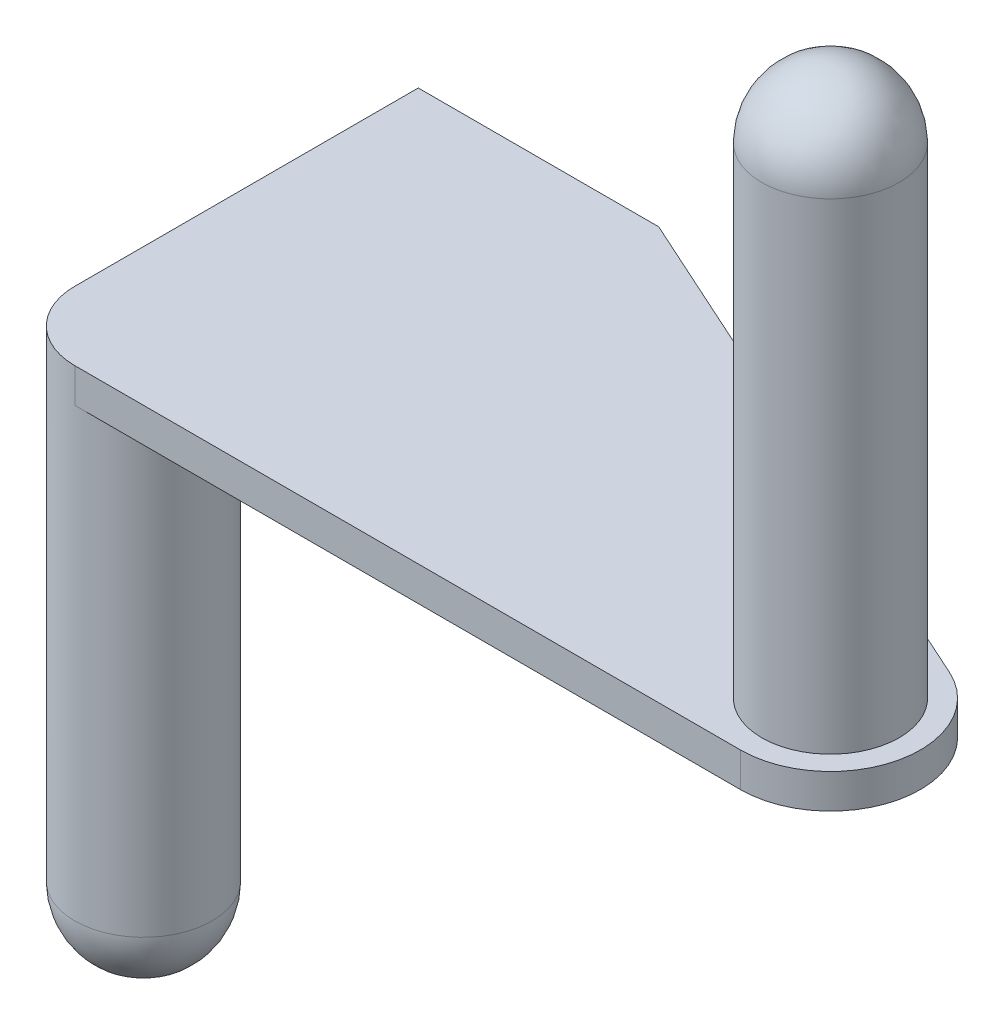
ISO-10303-21;
HEADER;
FILE_DESCRIPTION(('STEP AP214'),'2;1');
FILE_NAME('part.step','',(''),(''),'','','');
FILE_SCHEMA(('AUTOMOTIVE_DESIGN { 1 0 10303 214 1 1 1 1 }'));
ENDSEC;
DATA;
#1=APPLICATION_CONTEXT('core data for automotive mechanical design processes');
#2=APPLICATION_PROTOCOL_DEFINITION('international standard','automotive_design',2000,#1);
#3=PRODUCT_CONTEXT('',#1,'mechanical');
#4=PRODUCT('Part','Part','',(#3));
#5=PRODUCT_RELATED_PRODUCT_CATEGORY('part','',(#4));
#6=PRODUCT_DEFINITION_FORMATION('','',#4);
#7=PRODUCT_DEFINITION_CONTEXT('part definition',#1,'design');
#8=PRODUCT_DEFINITION('design','',#6,#7);
#9=PRODUCT_DEFINITION_SHAPE('','',#8);
#10=(LENGTH_UNIT() NAMED_UNIT(*) SI_UNIT(.MILLI.,.METRE.));
#11=(NAMED_UNIT(*) PLANE_ANGLE_UNIT() SI_UNIT($,.RADIAN.));
#12=(NAMED_UNIT(*) SI_UNIT($,.STERADIAN.) SOLID_ANGLE_UNIT());
#13=UNCERTAINTY_MEASURE_WITH_UNIT(LENGTH_MEASURE(1.E-05),#10,'distance_accuracy_value','');
#14=(GEOMETRIC_REPRESENTATION_CONTEXT(3) GLOBAL_UNCERTAINTY_ASSIGNED_CONTEXT((#13)) GLOBAL_UNIT_ASSIGNED_CONTEXT((#10,
#11,#12)) REPRESENTATION_CONTEXT('',''));
#15=CARTESIAN_POINT('',(0.,0.,0.));
#16=DIRECTION('',(0.,0.,1.));
#17=DIRECTION('',(1.,0.,0.));
#18=AXIS2_PLACEMENT_3D('',#15,#16,#17);
#19=CARTESIAN_POINT('',(-38.3909419454001,-16.,0.));
#20=DIRECTION('',(0.,1.,0.));
#21=DIRECTION('',(0.,0.,1.));
#22=AXIS2_PLACEMENT_3D('',#19,#20,#21);
#23=CYLINDRICAL_SURFACE('',#22,2.);
#24=CARTESIAN_POINT('',(-38.3909419454001,-1.,0.));
#25=DIRECTION('',(0.,-1.,0.));
#26=DIRECTION('',(0.,0.,-1.));
#27=AXIS2_PLACEMENT_3D('',#24,#25,#26);
#28=CIRCLE('',#27,2.);
#29=CARTESIAN_POINT('',(-38.3909419454001,-1.,2.));
#30=VERTEX_POINT('',#29);
#31=CARTESIAN_POINT('',(-40.3909419454001,-1.,0.));
#32=VERTEX_POINT('',#31);
#33=EDGE_CURVE('E179',#30,#32,#28,.F.);
#34=ORIENTED_EDGE('',*,*,#33,.F.);
#35=DIRECTION('',(0.,1.,0.));
#36=VECTOR('',#35,1.);
#37=CARTESIAN_POINT('',(-38.3909419454001,-1.,2.));
#38=LINE('',#37,#36);
#39=CARTESIAN_POINT('',(-38.3909419454001,0.,2.));
#40=VERTEX_POINT('',#39);
#41=EDGE_CURVE('E163',#30,#40,#38,.T.);
#42=ORIENTED_EDGE('',*,*,#41,.T.);
#43=CARTESIAN_POINT('',(-38.3909419454001,0.,0.));
#44=DIRECTION('',(0.,1.,0.));
#45=DIRECTION('',(0.,0.,1.));
#46=AXIS2_PLACEMENT_3D('',#43,#44,#45);
#47=CIRCLE('',#46,2.);
#48=CARTESIAN_POINT('',(-40.3909419454001,0.,0.));
#49=VERTEX_POINT('',#48);
#50=EDGE_CURVE('E196',#49,#40,#47,.T.);
#51=ORIENTED_EDGE('',*,*,#50,.F.);
#52=DIRECTION('',(0.,1.,0.));
#53=VECTOR('',#52,1.);
#54=CARTESIAN_POINT('',(-40.3909419454001,-1.,0.));
#55=LINE('',#54,#53);
#56=EDGE_CURVE('E189',#32,#49,#55,.T.);
#57=ORIENTED_EDGE('',*,*,#56,.F.);
#58=EDGE_LOOP('',(#34,#42,#51,#57));
#59=FACE_BOUND('',#58,.T.);
#60=CARTESIAN_POINT('',(-38.3909419454001,-14.,0.));
#61=DIRECTION('',(0.,1.,0.));
#62=DIRECTION('',(0.,0.,1.));
#63=AXIS2_PLACEMENT_3D('',#60,#61,#62);
#64=CIRCLE('',#63,2.);
#65=CARTESIAN_POINT('',(-38.3909419454001,-14.,2.));
#66=VERTEX_POINT('',#65);
#67=EDGE_CURVE('E191',#66,#66,#64,.T.);
#68=ORIENTED_EDGE('',*,*,#67,.T.);
#69=EDGE_LOOP('',(#68));
#70=FACE_BOUND('',#69,.T.);
#71=ADVANCED_FACE('F89',(#59,#70),#23,.T.);
#72=CARTESIAN_POINT('',(-38.3909419454001,0.,0.));
#73=DIRECTION('',(0.,1.,0.));
#74=DIRECTION('',(0.,0.,1.));
#75=AXIS2_PLACEMENT_3D('',#72,#73,#74);
#76=PLANE('',#75);
#77=CARTESIAN_POINT('',(-19.0077705365883,0.,-0.616828591188226));
#78=DIRECTION('',(0.,1.,0.));
#79=DIRECTION('',(0.,0.,1.));
#80=AXIS2_PLACEMENT_3D('',#77,#78,#79);
#81=CIRCLE('',#80,2.);
#82=CARTESIAN_POINT('',(-19.0077705365883,0.,1.38317140881178));
#83=VERTEX_POINT('',#82);
#84=EDGE_CURVE('E238',#83,#83,#81,.T.);
#85=ORIENTED_EDGE('',*,*,#84,.F.);
#86=EDGE_LOOP('',(#85));
#87=FACE_BOUND('',#86,.T.);
#88=ORIENTED_EDGE('',*,*,#50,.T.);
#89=DIRECTION('',(1.,0.,0.));
#90=VECTOR('',#89,1.);
#91=CARTESIAN_POINT('',(-19.0077705365883,0.,2.));
#92=LINE('',#91,#90);
#93=CARTESIAN_POINT('',(-19.0077705365883,0.,2.));
#94=VERTEX_POINT('',#93);
#95=EDGE_CURVE('E168',#40,#94,#92,.T.);
#96=ORIENTED_EDGE('',*,*,#95,.T.);
#97=CARTESIAN_POINT('',(-19.0077705365883,0.,-0.616828591188226));
#98=DIRECTION('',(0.,1.,0.));
#99=DIRECTION('',(0.,0.,-1.));
#100=AXIS2_PLACEMENT_3D('',#97,#98,#99);
#101=CIRCLE('',#100,2.61682859118822);
#102=CARTESIAN_POINT('',(-17.9286399146686,0.,-3.00078936613718));
#103=VERTEX_POINT('',#102);
#104=EDGE_CURVE('E251',#94,#103,#101,.T.);
#105=ORIENTED_EDGE('',*,*,#104,.T.);
#106=DIRECTION('',(-0.91101143688837,0.,-0.412381088143707));
#107=VECTOR('',#106,1.);
#108=CARTESIAN_POINT('',(-33.3909419454001,0.,-10.));
#109=LINE('',#108,#107);
#110=CARTESIAN_POINT('',(-33.3909419454001,0.,-10.));
#111=VERTEX_POINT('',#110);
#112=EDGE_CURVE('E254',#103,#111,#109,.T.);
#113=ORIENTED_EDGE('',*,*,#112,.T.);
#114=DIRECTION('',(-1.,0.,0.));
#115=VECTOR('',#114,1.);
#116=CARTESIAN_POINT('',(-40.3909419454001,0.,-10.));
#117=LINE('',#116,#115);
#118=CARTESIAN_POINT('',(-40.3909419454001,0.,-10.));
#119=VERTEX_POINT('',#118);
#120=EDGE_CURVE('E257',#111,#119,#117,.T.);
#121=ORIENTED_EDGE('',*,*,#120,.T.);
#122=DIRECTION('',(0.,0.,1.));
#123=VECTOR('',#122,1.);
#124=CARTESIAN_POINT('',(-40.3909419454001,0.,0.));
#125=LINE('',#124,#123);
#126=EDGE_CURVE('E184',#119,#49,#125,.T.);
#127=ORIENTED_EDGE('',*,*,#126,.T.);
#128=EDGE_LOOP('',(#88,#96,#105,#113,#121,#127));
#129=FACE_BOUND('',#128,.T.);
#130=ADVANCED_FACE('F269',(#87,#129),#76,.T.);
#131=CARTESIAN_POINT('',(-38.3909419454001,-14.,0.));
#132=DIRECTION('',(0.,1.,0.));
#133=DIRECTION('',(0.,0.,1.));
#134=AXIS2_PLACEMENT_3D('',#131,#132,#133);
#135=SPHERICAL_SURFACE('',#134,2.);
#136=ORIENTED_EDGE('',*,*,#67,.F.);
#137=EDGE_LOOP('',(#136));
#138=FACE_BOUND('',#137,.T.);
#139=ADVANCED_FACE('F294',(#138),#135,.T.);
#140=CARTESIAN_POINT('',(-40.3909419454001,-1.,0.));
#141=DIRECTION('',(-1.,0.,0.));
#142=DIRECTION('',(0.,0.,1.));
#143=AXIS2_PLACEMENT_3D('',#140,#141,#142);
#144=PLANE('',#143);
#145=ORIENTED_EDGE('',*,*,#126,.F.);
#146=DIRECTION('',(0.,1.,0.));
#147=VECTOR('',#146,1.);
#148=CARTESIAN_POINT('',(-40.3909419454001,-1.,-10.));
#149=LINE('',#148,#147);
#150=CARTESIAN_POINT('',(-40.3909419454001,-1.,-10.));
#151=VERTEX_POINT('',#150);
#152=EDGE_CURVE('E262',#151,#119,#149,.T.);
#153=ORIENTED_EDGE('',*,*,#152,.F.);
#154=DIRECTION('',(0.,0.,1.));
#155=VECTOR('',#154,1.);
#156=CARTESIAN_POINT('',(-40.3909419454001,-1.,0.));
#157=LINE('',#156,#155);
#158=EDGE_CURVE('E174',#151,#32,#157,.T.);
#159=ORIENTED_EDGE('',*,*,#158,.T.);
#160=ORIENTED_EDGE('',*,*,#56,.T.);
#161=EDGE_LOOP('',(#145,#153,#159,#160));
#162=FACE_BOUND('',#161,.T.);
#163=ADVANCED_FACE('F273',(#162),#144,.T.);
#164=CARTESIAN_POINT('',(-40.3909419454001,-1.,-10.));
#165=DIRECTION('',(0.,0.,-1.));
#166=DIRECTION('',(-1.,0.,0.));
#167=AXIS2_PLACEMENT_3D('',#164,#165,#166);
#168=PLANE('',#167);
#169=CARTESIAN_POINT('',(-36.8909419454001,-4.14203978385195,-10.));
#170=DIRECTION('',(0.,0.,-1.));
#171=DIRECTION('',(-1.,0.,0.));
#172=AXIS2_PLACEMENT_3D('',#169,#170,#171);
#173=CIRCLE('',#172,2.);
#174=CARTESIAN_POINT('',(-38.8909419454001,-4.14203978385195,-10.));
#175=VERTEX_POINT('',#174);
#176=EDGE_CURVE('E244',#175,#175,#173,.T.);
#177=ORIENTED_EDGE('',*,*,#176,.F.);
#178=EDGE_LOOP('',(#177));
#179=FACE_BOUND('',#178,.T.);
#180=DIRECTION('',(-1.,0.,0.));
#181=VECTOR('',#180,1.);
#182=CARTESIAN_POINT('',(-40.3909419454001,-1.,-10.));
#183=LINE('',#182,#181);
#184=CARTESIAN_POINT('',(-33.3909419454001,-1.,-10.));
#185=VERTEX_POINT('',#184);
#186=CARTESIAN_POINT('',(-34.6471946534279,-1.,-10.));
#187=VERTEX_POINT('',#186);
#188=EDGE_CURVE('E228',#185,#187,#183,.T.);
#189=ORIENTED_EDGE('',*,*,#188,.T.);
#190=CARTESIAN_POINT('',(-34.6471946534279,-1.2,-10.));
#191=DIRECTION('',(0.,0.,-1.));
#192=DIRECTION('',(-1.,0.,0.));
#193=AXIS2_PLACEMENT_3D('',#190,#191,#192);
#194=CIRCLE('',#193,0.2);
#195=CARTESIAN_POINT('',(-34.7684782908318,-1.35902917750551,-10.));
#196=VERTEX_POINT('',#195);
#197=EDGE_CURVE('E213',#187,#196,#194,.F.);
#198=ORIENTED_EDGE('',*,*,#197,.T.);
#199=CARTESIAN_POINT('',(-36.8909419454001,-4.14203978385195,-10.));
#200=DIRECTION('',(0.,0.,-1.));
#201=DIRECTION('',(-1.,0.,0.));
#202=AXIS2_PLACEMENT_3D('',#199,#200,#201);
#203=CIRCLE('',#202,3.5);
#204=CARTESIAN_POINT('',(-39.0134055999684,-1.35902917750551,-10.));
#205=VERTEX_POINT('',#204);
#206=EDGE_CURVE('E223',#196,#205,#203,.T.);
#207=ORIENTED_EDGE('',*,*,#206,.T.);
#208=CARTESIAN_POINT('',(-39.1346892373723,-1.2,-10.));
#209=DIRECTION('',(0.,0.,-1.));
#210=DIRECTION('',(-1.,0.,0.));
#211=AXIS2_PLACEMENT_3D('',#208,#209,#210);
#212=CIRCLE('',#211,0.2);
#213=CARTESIAN_POINT('',(-39.1346892373723,-1.,-10.));
#214=VERTEX_POINT('',#213);
#215=EDGE_CURVE('E98',#205,#214,#212,.F.);
#216=ORIENTED_EDGE('',*,*,#215,.T.);
#217=EDGE_CURVE('E220',#214,#151,#183,.T.);
#218=ORIENTED_EDGE('',*,*,#217,.T.);
#219=ORIENTED_EDGE('',*,*,#152,.T.);
#220=ORIENTED_EDGE('',*,*,#120,.F.);
#221=DIRECTION('',(0.,1.,0.));
#222=VECTOR('',#221,1.);
#223=CARTESIAN_POINT('',(-33.3909419454001,-1.,-10.));
#224=LINE('',#223,#222);
#225=EDGE_CURVE('E264',#185,#111,#224,.T.);
#226=ORIENTED_EDGE('',*,*,#225,.F.);
#227=EDGE_LOOP('',(#189,#198,#207,#216,#218,#219,#220,#226));
#228=FACE_BOUND('',#227,.T.);
#229=ADVANCED_FACE('F219',(#179,#228),#168,.T.);
#230=CARTESIAN_POINT('',(-33.3909419454001,-1.,-10.));
#231=DIRECTION('',(0.412381088143707,0.,-0.91101143688837));
#232=DIRECTION('',(-0.91101143688837,0.,-0.412381088143707));
#233=AXIS2_PLACEMENT_3D('',#230,#231,#232);
#234=PLANE('',#233);
#235=ORIENTED_EDGE('',*,*,#112,.F.);
#236=DIRECTION('',(0.,1.,0.));
#237=VECTOR('',#236,1.);
#238=CARTESIAN_POINT('',(-17.9286399146686,-1.,-3.00078936613718));
#239=LINE('',#238,#237);
#240=CARTESIAN_POINT('',(-17.9286399146686,-1.,-3.00078936613718));
#241=VERTEX_POINT('',#240);
#242=EDGE_CURVE('E266',#241,#103,#239,.T.);
#243=ORIENTED_EDGE('',*,*,#242,.F.);
#244=DIRECTION('',(-0.91101143688837,0.,-0.412381088143707));
#245=VECTOR('',#244,1.);
#246=CARTESIAN_POINT('',(-33.3909419454001,-1.,-10.));
#247=LINE('',#246,#245);
#248=EDGE_CURVE('E229',#241,#185,#247,.T.);
#249=ORIENTED_EDGE('',*,*,#248,.T.);
#250=ORIENTED_EDGE('',*,*,#225,.T.);
#251=EDGE_LOOP('',(#235,#243,#249,#250));
#252=FACE_BOUND('',#251,.T.);
#253=ADVANCED_FACE('F278',(#252),#234,.T.);
#254=CARTESIAN_POINT('',(-19.0077705365883,-1.,-0.616828591188226));
#255=DIRECTION('',(0.,1.,0.));
#256=DIRECTION('',(0.,0.,1.));
#257=AXIS2_PLACEMENT_3D('',#254,#255,#256);
#258=CYLINDRICAL_SURFACE('',#257,2.61682859118822);
#259=ORIENTED_EDGE('',*,*,#104,.F.);
#260=DIRECTION('',(0.,1.,0.));
#261=VECTOR('',#260,1.);
#262=CARTESIAN_POINT('',(-19.0077705365883,-1.,2.));
#263=LINE('',#262,#261);
#264=CARTESIAN_POINT('',(-19.0077705365883,-1.,2.));
#265=VERTEX_POINT('',#264);
#266=EDGE_CURVE('E173',#265,#94,#263,.T.);
#267=ORIENTED_EDGE('',*,*,#266,.F.);
#268=CARTESIAN_POINT('',(-19.0077705365883,-1.,-0.616828591188226));
#269=DIRECTION('',(0.,1.,0.));
#270=DIRECTION('',(0.,0.,-1.));
#271=AXIS2_PLACEMENT_3D('',#268,#269,#270);
#272=CIRCLE('',#271,2.61682859118822);
#273=EDGE_CURVE('E183',#265,#241,#272,.T.);
#274=ORIENTED_EDGE('',*,*,#273,.T.);
#275=ORIENTED_EDGE('',*,*,#242,.T.);
#276=EDGE_LOOP('',(#259,#267,#274,#275));
#277=FACE_BOUND('',#276,.T.);
#278=ADVANCED_FACE('F280',(#277),#258,.T.);
#279=CARTESIAN_POINT('',(-19.0077705365883,-1.,2.));
#280=DIRECTION('',(0.,0.,1.));
#281=DIRECTION('',(1.,0.,0.));
#282=AXIS2_PLACEMENT_3D('',#279,#280,#281);
#283=PLANE('',#282);
#284=ORIENTED_EDGE('',*,*,#95,.F.);
#285=ORIENTED_EDGE('',*,*,#41,.F.);
#286=DIRECTION('',(1.,0.,0.));
#287=VECTOR('',#286,1.);
#288=CARTESIAN_POINT('',(-19.0077705365883,-1.,2.));
#289=LINE('',#288,#287);
#290=EDGE_CURVE('E166',#30,#265,#289,.T.);
#291=ORIENTED_EDGE('',*,*,#290,.T.);
#292=ORIENTED_EDGE('',*,*,#266,.T.);
#293=EDGE_LOOP('',(#284,#285,#291,#292));
#294=FACE_BOUND('',#293,.T.);
#295=ADVANCED_FACE('F165',(#294),#283,.T.);
#296=CARTESIAN_POINT('',(-38.3909419454001,-1.,0.));
#297=DIRECTION('',(0.,-1.,0.));
#298=DIRECTION('',(0.,0.,-1.));
#299=AXIS2_PLACEMENT_3D('',#296,#297,#298);
#300=PLANE('',#299);
#301=DIRECTION('',(1.,0.,0.));
#302=VECTOR('',#301,1.);
#303=CARTESIAN_POINT('',(-38.3909419454001,-1.,-7.));
#304=LINE('',#303,#302);
#305=CARTESIAN_POINT('',(-39.1346892373723,-1.,-7.));
#306=VERTEX_POINT('',#305);
#307=CARTESIAN_POINT('',(-34.6471946534279,-1.,-7.));
#308=VERTEX_POINT('',#307);
#309=EDGE_CURVE('E105',#306,#308,#304,.T.);
#310=ORIENTED_EDGE('',*,*,#309,.T.);
#311=DIRECTION('',(0.,0.,1.));
#312=VECTOR('',#311,1.);
#313=CARTESIAN_POINT('',(-34.6471946534279,-1.,-10.));
#314=LINE('',#313,#312);
#315=EDGE_CURVE('E209',#308,#187,#314,.F.);
#316=ORIENTED_EDGE('',*,*,#315,.T.);
#317=ORIENTED_EDGE('',*,*,#188,.F.);
#318=ORIENTED_EDGE('',*,*,#248,.F.);
#319=ORIENTED_EDGE('',*,*,#273,.F.);
#320=ORIENTED_EDGE('',*,*,#290,.F.);
#321=ORIENTED_EDGE('',*,*,#33,.T.);
#322=ORIENTED_EDGE('',*,*,#158,.F.);
#323=ORIENTED_EDGE('',*,*,#217,.F.);
#324=DIRECTION('',(0.,0.,1.));
#325=VECTOR('',#324,1.);
#326=CARTESIAN_POINT('',(-39.1346892373723,-1.,-7.));
#327=LINE('',#326,#325);
#328=EDGE_CURVE('E207',#214,#306,#327,.T.);
#329=ORIENTED_EDGE('',*,*,#328,.T.);
#330=EDGE_LOOP('',(#310,#316,#317,#318,#319,#320,#321,#322,#323,#329));
#331=FACE_BOUND('',#330,.T.);
#332=ADVANCED_FACE('F177',(#331),#300,.T.);
#333=CARTESIAN_POINT('',(-19.0077705365883,16.,-0.616828591188226));
#334=DIRECTION('',(0.,-1.,0.));
#335=DIRECTION('',(0.,0.,-1.));
#336=AXIS2_PLACEMENT_3D('',#333,#334,#335);
#337=CYLINDRICAL_SURFACE('',#336,2.);
#338=CARTESIAN_POINT('',(-19.0077705365883,14.,-0.616828591188226));
#339=DIRECTION('',(0.,-1.,0.));
#340=DIRECTION('',(0.,0.,-1.));
#341=AXIS2_PLACEMENT_3D('',#338,#339,#340);
#342=CIRCLE('',#341,2.);
#343=CARTESIAN_POINT('',(-19.0077705365883,14.,-2.61682859118823));
#344=VERTEX_POINT('',#343);
#345=EDGE_CURVE('E190',#344,#344,#342,.T.);
#346=ORIENTED_EDGE('',*,*,#345,.T.);
#347=EDGE_LOOP('',(#346));
#348=FACE_BOUND('',#347,.T.);
#349=ORIENTED_EDGE('',*,*,#84,.T.);
#350=EDGE_LOOP('',(#349));
#351=FACE_BOUND('',#350,.T.);
#352=ADVANCED_FACE('F303',(#348,#351),#337,.T.);
#353=CARTESIAN_POINT('',(-19.0077705365883,14.,-0.616828591188226));
#354=DIRECTION('',(0.,1.,0.));
#355=DIRECTION('',(0.,0.,1.));
#356=AXIS2_PLACEMENT_3D('',#353,#354,#355);
#357=SPHERICAL_SURFACE('',#356,2.);
#358=ORIENTED_EDGE('',*,*,#345,.F.);
#359=EDGE_LOOP('',(#358));
#360=FACE_BOUND('',#359,.T.);
#361=ADVANCED_FACE('F301',(#360),#357,.T.);
#362=CARTESIAN_POINT('',(-36.8909419454001,-4.14203978385195,-7.));
#363=DIRECTION('',(0.,0.,-1.));
#364=DIRECTION('',(-1.,0.,0.));
#365=AXIS2_PLACEMENT_3D('',#362,#363,#364);
#366=PLANE('',#365);
#367=CARTESIAN_POINT('',(-36.8909419454001,-4.14203978385195,-7.));
#368=DIRECTION('',(0.,0.,-1.));
#369=DIRECTION('',(-1.,0.,0.));
#370=AXIS2_PLACEMENT_3D('',#367,#368,#369);
#371=CIRCLE('',#370,2.);
#372=CARTESIAN_POINT('',(-38.8909419454001,-4.14203978385195,-7.));
#373=VERTEX_POINT('',#372);
#374=EDGE_CURVE('E93',#373,#373,#371,.T.);
#375=ORIENTED_EDGE('',*,*,#374,.T.);
#376=EDGE_LOOP('',(#375));
#377=FACE_BOUND('',#376,.T.);
#378=ORIENTED_EDGE('',*,*,#309,.F.);
#379=CARTESIAN_POINT('',(-39.1346892373723,-1.2,-7.));
#380=DIRECTION('',(0.,0.,-1.));
#381=DIRECTION('',(-1.,0.,0.));
#382=AXIS2_PLACEMENT_3D('',#379,#380,#381);
#383=CIRCLE('',#382,0.2);
#384=CARTESIAN_POINT('',(-39.0134055999684,-1.35902917750551,-7.));
#385=VERTEX_POINT('',#384);
#386=EDGE_CURVE('E12',#306,#385,#383,.T.);
#387=ORIENTED_EDGE('',*,*,#386,.T.);
#388=CARTESIAN_POINT('',(-36.8909419454001,-4.14203978385195,-7.));
#389=DIRECTION('',(0.,0.,-1.));
#390=DIRECTION('',(-1.,0.,0.));
#391=AXIS2_PLACEMENT_3D('',#388,#389,#390);
#392=CIRCLE('',#391,3.5);
#393=CARTESIAN_POINT('',(-34.7684782908318,-1.35902917750551,-7.));
#394=VERTEX_POINT('',#393);
#395=EDGE_CURVE('E234',#394,#385,#392,.T.);
#396=ORIENTED_EDGE('',*,*,#395,.F.);
#397=CARTESIAN_POINT('',(-34.6471946534279,-1.2,-7.));
#398=DIRECTION('',(0.,0.,-1.));
#399=DIRECTION('',(-1.,0.,0.));
#400=AXIS2_PLACEMENT_3D('',#397,#398,#399);
#401=CIRCLE('',#400,0.2);
#402=EDGE_CURVE('E211',#394,#308,#401,.T.);
#403=ORIENTED_EDGE('',*,*,#402,.T.);
#404=EDGE_LOOP('',(#378,#387,#396,#403));
#405=FACE_BOUND('',#404,.T.);
#406=ADVANCED_FACE('F233',(#377,#405),#366,.F.);
#407=CARTESIAN_POINT('',(-36.8909419454001,-4.14203978385195,-7.));
#408=DIRECTION('',(0.,0.,-1.));
#409=DIRECTION('',(-1.,0.,0.));
#410=AXIS2_PLACEMENT_3D('',#407,#408,#409);
#411=CYLINDRICAL_SURFACE('',#410,3.5);
#412=ORIENTED_EDGE('',*,*,#206,.F.);
#413=DIRECTION('',(0.,0.,-1.));
#414=VECTOR('',#413,1.);
#415=CARTESIAN_POINT('',(-34.7684782908318,-1.35902917750551,-7.));
#416=LINE('',#415,#414);
#417=EDGE_CURVE('E204',#196,#394,#416,.F.);
#418=ORIENTED_EDGE('',*,*,#417,.T.);
#419=ORIENTED_EDGE('',*,*,#395,.T.);
#420=DIRECTION('',(0.,0.,-1.));
#421=VECTOR('',#420,1.);
#422=CARTESIAN_POINT('',(-39.0134055999684,-1.35902917750551,-7.));
#423=LINE('',#422,#421);
#424=EDGE_CURVE('E201',#385,#205,#423,.T.);
#425=ORIENTED_EDGE('',*,*,#424,.T.);
#426=EDGE_LOOP('',(#412,#418,#419,#425));
#427=FACE_BOUND('',#426,.T.);
#428=ADVANCED_FACE('F236',(#427),#411,.T.);
#429=CARTESIAN_POINT('',(-34.6471946534279,-1.2,-7.));
#430=DIRECTION('',(0.,0.,-1.));
#431=DIRECTION('',(-1.,0.,0.));
#432=AXIS2_PLACEMENT_3D('',#429,#430,#431);
#433=CYLINDRICAL_SURFACE('',#432,0.2);
#434=ORIENTED_EDGE('',*,*,#197,.F.);
#435=ORIENTED_EDGE('',*,*,#315,.F.);
#436=ORIENTED_EDGE('',*,*,#402,.F.);
#437=ORIENTED_EDGE('',*,*,#417,.F.);
#438=EDGE_LOOP('',(#434,#435,#436,#437));
#439=FACE_BOUND('',#438,.T.);
#440=ADVANCED_FACE('F305',(#439),#433,.F.);
#441=CARTESIAN_POINT('',(-39.1346892373723,-1.2,-7.));
#442=DIRECTION('',(0.,0.,-1.));
#443=DIRECTION('',(-1.,0.,0.));
#444=AXIS2_PLACEMENT_3D('',#441,#442,#443);
#445=CYLINDRICAL_SURFACE('',#444,0.2);
#446=ORIENTED_EDGE('',*,*,#386,.F.);
#447=ORIENTED_EDGE('',*,*,#328,.F.);
#448=ORIENTED_EDGE('',*,*,#215,.F.);
#449=ORIENTED_EDGE('',*,*,#424,.F.);
#450=EDGE_LOOP('',(#446,#447,#448,#449));
#451=FACE_BOUND('',#450,.T.);
#452=ADVANCED_FACE('F91',(#451),#445,.F.);
#453=CARTESIAN_POINT('',(-36.8909419454001,-4.14203978385195,-4.));
#454=DIRECTION('',(0.,0.,-1.));
#455=DIRECTION('',(-1.,0.,0.));
#456=AXIS2_PLACEMENT_3D('',#453,#454,#455);
#457=CYLINDRICAL_SURFACE('',#456,2.);
#458=ORIENTED_EDGE('',*,*,#176,.T.);
#459=EDGE_LOOP('',(#458));
#460=FACE_BOUND('',#459,.T.);
#461=ORIENTED_EDGE('',*,*,#374,.F.);
#462=EDGE_LOOP('',(#461));
#463=FACE_BOUND('',#462,.T.);
#464=ADVANCED_FACE('F312',(#460,#463),#457,.F.);
#465=CLOSED_SHELL('',(#71,#130,#139,#163,#229,#253,#278,#295,#332,#352,#361,#406,#428,#440,#452,#464));
#466=MANIFOLD_SOLID_BREP('B2',#465);
#467=ADVANCED_BREP_SHAPE_REPRESENTATION('',(#18,#466),#14);
#468=SHAPE_DEFINITION_REPRESENTATION(#9,#467);
ENDSEC;
END-ISO-10303-21;
